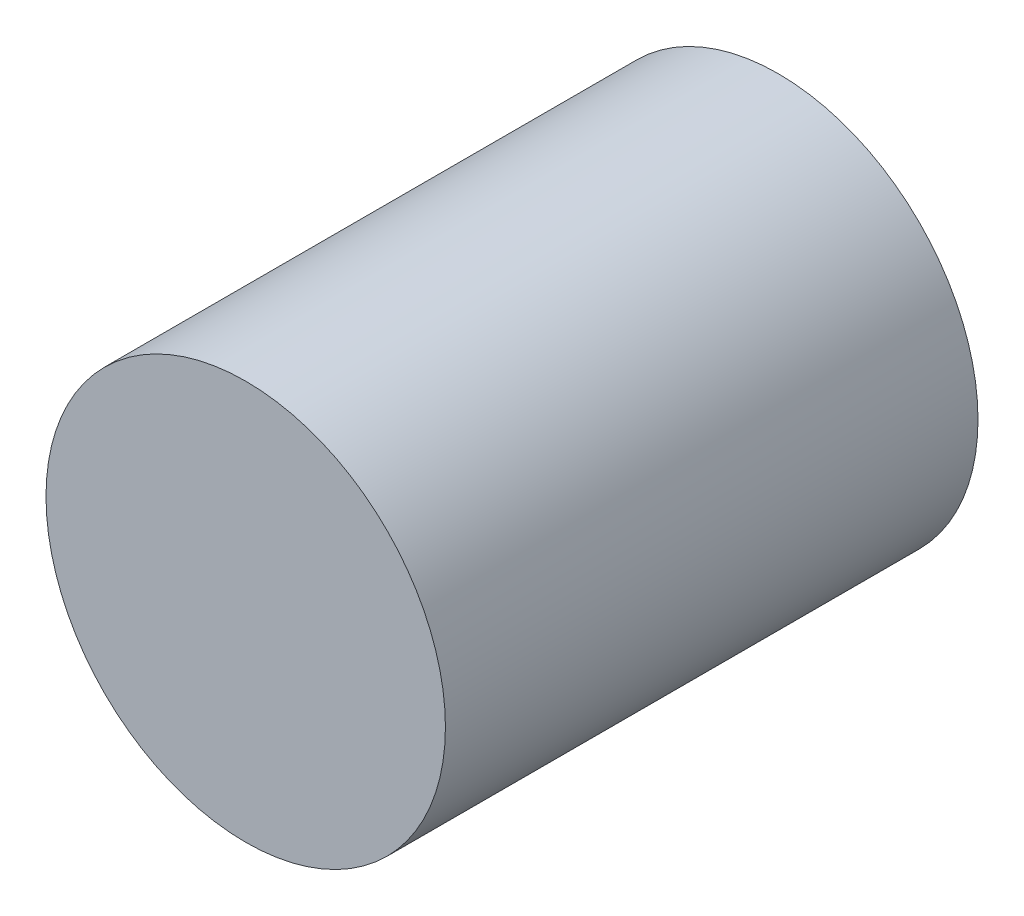
ISO-10303-21;
HEADER;
FILE_DESCRIPTION(('STEP AP214'),'2;1');
FILE_NAME('part.step','',(''),(''),'','','');
FILE_SCHEMA(('AUTOMOTIVE_DESIGN { 1 0 10303 214 1 1 1 1 }'));
ENDSEC;
DATA;
#1=APPLICATION_CONTEXT('core data for automotive mechanical design processes');
#2=APPLICATION_PROTOCOL_DEFINITION('international standard','automotive_design',2000,#1);
#3=PRODUCT_CONTEXT('',#1,'mechanical');
#4=PRODUCT('Part','Part','',(#3));
#5=PRODUCT_RELATED_PRODUCT_CATEGORY('part','',(#4));
#6=PRODUCT_DEFINITION_FORMATION('','',#4);
#7=PRODUCT_DEFINITION_CONTEXT('part definition',#1,'design');
#8=PRODUCT_DEFINITION('design','',#6,#7);
#9=PRODUCT_DEFINITION_SHAPE('','',#8);
#10=(LENGTH_UNIT() NAMED_UNIT(*) SI_UNIT(.MILLI.,.METRE.));
#11=(NAMED_UNIT(*) PLANE_ANGLE_UNIT() SI_UNIT($,.RADIAN.));
#12=(NAMED_UNIT(*) SI_UNIT($,.STERADIAN.) SOLID_ANGLE_UNIT());
#13=UNCERTAINTY_MEASURE_WITH_UNIT(LENGTH_MEASURE(1.E-05),#10,'distance_accuracy_value','');
#14=(GEOMETRIC_REPRESENTATION_CONTEXT(3) GLOBAL_UNCERTAINTY_ASSIGNED_CONTEXT((#13)) GLOBAL_UNIT_ASSIGNED_CONTEXT((#10,
#11,#12)) REPRESENTATION_CONTEXT('',''));
#15=CARTESIAN_POINT('',(0.,0.,0.));
#16=DIRECTION('',(0.,0.,1.));
#17=DIRECTION('',(1.,0.,0.));
#18=AXIS2_PLACEMENT_3D('',#15,#16,#17);
#19=CARTESIAN_POINT('',(0.,0.,12.7));
#20=DIRECTION('',(0.,0.,-1.));
#21=DIRECTION('',(-1.,0.,0.));
#22=AXIS2_PLACEMENT_3D('',#19,#20,#21);
#23=CYLINDRICAL_SURFACE('',#22,9.525);
#24=CARTESIAN_POINT('',(0.,0.,12.7));
#25=DIRECTION('',(0.,0.,1.));
#26=DIRECTION('',(1.,0.,0.));
#27=AXIS2_PLACEMENT_3D('',#24,#25,#26);
#28=CIRCLE('',#27,9.525);
#29=CARTESIAN_POINT('',(9.525,0.,12.7));
#30=VERTEX_POINT('',#29);
#31=EDGE_CURVE('E10',#30,#30,#28,.T.);
#32=ORIENTED_EDGE('',*,*,#31,.F.);
#33=EDGE_LOOP('',(#32));
#34=FACE_BOUND('',#33,.T.);
#35=CARTESIAN_POINT('',(0.,0.,-12.7));
#36=DIRECTION('',(0.,0.,1.));
#37=DIRECTION('',(1.,0.,0.));
#38=AXIS2_PLACEMENT_3D('',#35,#36,#37);
#39=CIRCLE('',#38,9.525);
#40=CARTESIAN_POINT('',(9.525,0.,-12.7));
#41=VERTEX_POINT('',#40);
#42=EDGE_CURVE('E42',#41,#41,#39,.T.);
#43=ORIENTED_EDGE('',*,*,#42,.T.);
#44=EDGE_LOOP('',(#43));
#45=FACE_BOUND('',#44,.T.);
#46=ADVANCED_FACE('F39',(#34,#45),#23,.T.);
#47=CARTESIAN_POINT('',(0.,0.,12.7));
#48=DIRECTION('',(0.,0.,1.));
#49=DIRECTION('',(1.,0.,0.));
#50=AXIS2_PLACEMENT_3D('',#47,#48,#49);
#51=PLANE('',#50);
#52=ORIENTED_EDGE('',*,*,#31,.T.);
#53=EDGE_LOOP('',(#52));
#54=FACE_BOUND('',#53,.T.);
#55=ADVANCED_FACE('F56',(#54),#51,.T.);
#56=CARTESIAN_POINT('',(0.,0.,-12.7));
#57=DIRECTION('',(0.,0.,1.));
#58=DIRECTION('',(1.,0.,0.));
#59=AXIS2_PLACEMENT_3D('',#56,#57,#58);
#60=PLANE('',#59);
#61=ORIENTED_EDGE('',*,*,#42,.F.);
#62=EDGE_LOOP('',(#61));
#63=FACE_BOUND('',#62,.T.);
#64=ADVANCED_FACE('F54',(#63),#60,.F.);
#65=CLOSED_SHELL('',(#46,#55,#64));
#66=MANIFOLD_SOLID_BREP('B2',#65);
#67=ADVANCED_BREP_SHAPE_REPRESENTATION('',(#18,#66),#14);
#68=SHAPE_DEFINITION_REPRESENTATION(#9,#67);
ENDSEC;
END-ISO-10303-21;
